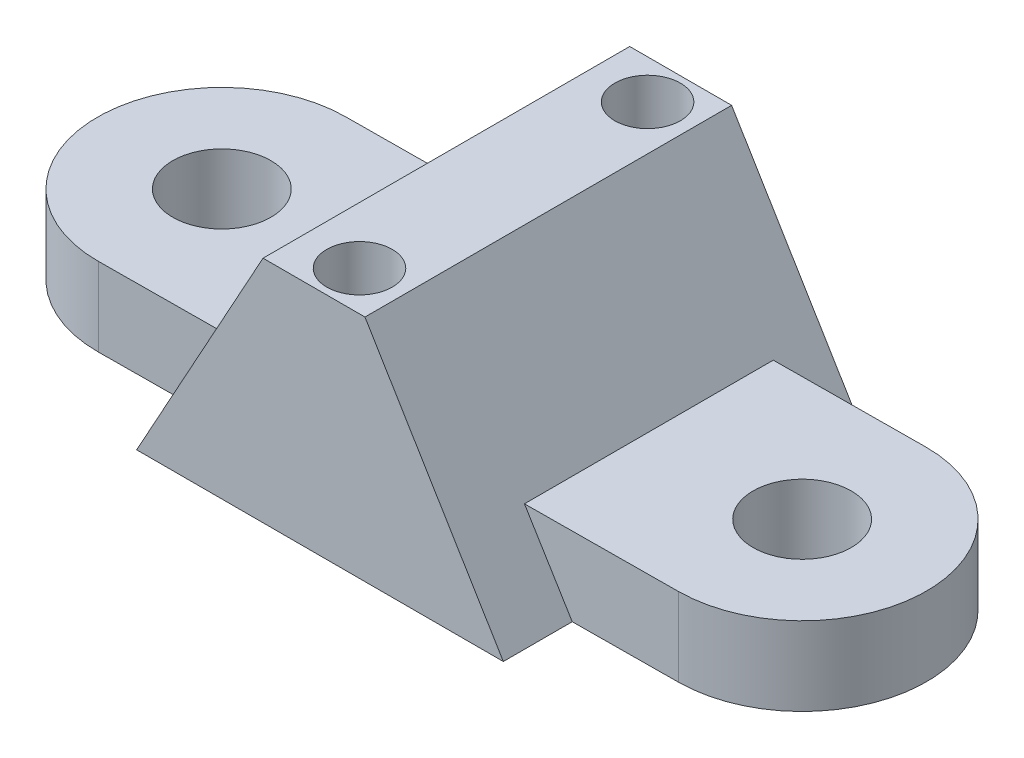
ISO-10303-21;
HEADER;
FILE_DESCRIPTION(('STEP AP214'),'2;1');
FILE_NAME('part.step','',(''),(''),'','','');
FILE_SCHEMA(('AUTOMOTIVE_DESIGN { 1 0 10303 214 1 1 1 1 }'));
ENDSEC;
DATA;
#1=APPLICATION_CONTEXT('core data for automotive mechanical design processes');
#2=APPLICATION_PROTOCOL_DEFINITION('international standard','automotive_design',2000,#1);
#3=PRODUCT_CONTEXT('',#1,'mechanical');
#4=PRODUCT('Part','Part','',(#3));
#5=PRODUCT_RELATED_PRODUCT_CATEGORY('part','',(#4));
#6=PRODUCT_DEFINITION_FORMATION('','',#4);
#7=PRODUCT_DEFINITION_CONTEXT('part definition',#1,'design');
#8=PRODUCT_DEFINITION('design','',#6,#7);
#9=PRODUCT_DEFINITION_SHAPE('','',#8);
#10=(LENGTH_UNIT() NAMED_UNIT(*) SI_UNIT(.MILLI.,.METRE.));
#11=(NAMED_UNIT(*) PLANE_ANGLE_UNIT() SI_UNIT($,.RADIAN.));
#12=(NAMED_UNIT(*) SI_UNIT($,.STERADIAN.) SOLID_ANGLE_UNIT());
#13=UNCERTAINTY_MEASURE_WITH_UNIT(LENGTH_MEASURE(1.E-05),#10,'distance_accuracy_value','');
#14=(GEOMETRIC_REPRESENTATION_CONTEXT(3) GLOBAL_UNCERTAINTY_ASSIGNED_CONTEXT((#13)) GLOBAL_UNIT_ASSIGNED_CONTEXT((#10,
#11,#12)) REPRESENTATION_CONTEXT('',''));
#15=CARTESIAN_POINT('',(0.,0.,0.));
#16=DIRECTION('',(0.,0.,1.));
#17=DIRECTION('',(1.,0.,0.));
#18=AXIS2_PLACEMENT_3D('',#15,#16,#17);
#19=CARTESIAN_POINT('',(-8.6988263836432,35.,56.));
#20=DIRECTION('',(0.875674720216931,-0.482901423038904,0.));
#21=DIRECTION('',(0.482901423038904,0.875674720216931,0.));
#22=AXIS2_PLACEMENT_3D('',#19,#20,#21);
#23=PLANE('',#22);
#24=DIRECTION('',(0.482898527062331,0.87566946876528,-0.0034632402982212));
#25=VECTOR('',#24,1.);
#26=CARTESIAN_POINT('',(-8.71598730364331,34.9688810529379,45.7388307557671));
#27=LINE('',#26,#25);
#28=CARTESIAN_POINT('',(-28.,0.,45.8771313844472));
#29=VERTEX_POINT('',#28);
#30=CARTESIAN_POINT('',(-21.3824547601062,12.,45.8296718291458));
#31=VERTEX_POINT('',#30);
#32=EDGE_CURVE('E207',#29,#31,#27,.T.);
#33=ORIENTED_EDGE('',*,*,#32,.F.);
#34=DIRECTION('',(0.,0.,-1.));
#35=VECTOR('',#34,1.);
#36=CARTESIAN_POINT('',(-28.,0.,56.));
#37=LINE('',#36,#35);
#38=CARTESIAN_POINT('',(-28.,0.,56.));
#39=VERTEX_POINT('',#38);
#40=EDGE_CURVE('E236',#39,#29,#37,.T.);
#41=ORIENTED_EDGE('',*,*,#40,.F.);
#42=DIRECTION('',(-0.482901423038904,-0.875674720216931,0.));
#43=VECTOR('',#42,1.);
#44=CARTESIAN_POINT('',(-8.6988263836432,35.,56.));
#45=LINE('',#44,#43);
#46=CARTESIAN_POINT('',(-8.6988263836432,35.,56.));
#47=VERTEX_POINT('',#46);
#48=EDGE_CURVE('E213',#47,#39,#45,.T.);
#49=ORIENTED_EDGE('',*,*,#48,.F.);
#50=DIRECTION('',(0.,0.,-1.));
#51=VECTOR('',#50,1.);
#52=CARTESIAN_POINT('',(-8.6988263836432,35.,56.));
#53=LINE('',#52,#51);
#54=CARTESIAN_POINT('',(-8.6988263836432,35.,0.));
#55=VERTEX_POINT('',#54);
#56=EDGE_CURVE('E239',#47,#55,#53,.T.);
#57=ORIENTED_EDGE('',*,*,#56,.T.);
#58=DIRECTION('',(-0.482901423038904,-0.875674720216931,0.));
#59=VECTOR('',#58,1.);
#60=CARTESIAN_POINT('',(-8.6988263836432,35.,0.));
#61=LINE('',#60,#59);
#62=CARTESIAN_POINT('',(-28.,0.,0.));
#63=VERTEX_POINT('',#62);
#64=EDGE_CURVE('E223',#55,#63,#61,.T.);
#65=ORIENTED_EDGE('',*,*,#64,.T.);
#66=CARTESIAN_POINT('',(-28.,0.,7.87615414383349));
#67=VERTEX_POINT('',#66);
#68=EDGE_CURVE('E235',#67,#63,#37,.T.);
#69=ORIENTED_EDGE('',*,*,#68,.F.);
#70=DIRECTION('',(0.482898527062331,0.87566946876528,-0.00346324029822119));
#71=VECTOR('',#70,1.);
#72=CARTESIAN_POINT('',(-8.77953989625151,34.8536372452037,7.73830930014221));
#73=LINE('',#72,#71);
#74=CARTESIAN_POINT('',(-21.3824547601062,12.,7.82869458853204));
#75=VERTEX_POINT('',#74);
#76=EDGE_CURVE('E205',#67,#75,#73,.T.);
#77=ORIENTED_EDGE('',*,*,#76,.T.);
#78=DIRECTION('',(0.,0.,-1.));
#79=VECTOR('',#78,1.);
#80=CARTESIAN_POINT('',(-21.3824547601062,12.,56.));
#81=LINE('',#80,#79);
#82=EDGE_CURVE('E171',#31,#75,#81,.T.);
#83=ORIENTED_EDGE('',*,*,#82,.F.);
#84=EDGE_LOOP('',(#33,#41,#49,#57,#65,#69,#77,#83));
#85=FACE_BOUND('',#84,.T.);
#86=ADVANCED_FACE('F67',(#85),#23,.F.);
#87=CARTESIAN_POINT('',(28.,0.,56.));
#88=DIRECTION('',(-0.856042259983815,-0.516905841640237,0.));
#89=DIRECTION('',(0.516905841640237,-0.856042259983815,0.));
#90=AXIS2_PLACEMENT_3D('',#87,#88,#89);
#91=PLANE('',#90);
#92=DIRECTION('',(0.516902289800679,-0.856036377820145,-0.00370710768403204));
#93=VECTOR('',#92,1.);
#94=CARTESIAN_POINT('',(27.9798328448716,0.033398610854824,45.4756565359413));
#95=LINE('',#94,#93);
#96=CARTESIAN_POINT('',(20.7540141536936,12.,45.5274784924736));
#97=VERTEX_POINT('',#96);
#98=CARTESIAN_POINT('',(28.,0.,45.4755119016125));
#99=VERTEX_POINT('',#98);
#100=EDGE_CURVE('E12',#97,#99,#95,.T.);
#101=ORIENTED_EDGE('',*,*,#100,.F.);
#102=DIRECTION('',(0.,0.,1.));
#103=VECTOR('',#102,1.);
#104=CARTESIAN_POINT('',(20.7540141536936,12.,56.));
#105=LINE('',#104,#103);
#106=CARTESIAN_POINT('',(20.7540141536936,12.,7.52650125185992));
#107=VERTEX_POINT('',#106);
#108=EDGE_CURVE('E242',#107,#97,#105,.T.);
#109=ORIENTED_EDGE('',*,*,#108,.F.);
#110=DIRECTION('',(0.516902289800679,-0.856036377820145,-0.00370710768403203));
#111=VECTOR('',#110,1.);
#112=CARTESIAN_POINT('',(27.9070148991553,0.153991635341852,7.47520152935799));
#113=LINE('',#112,#111);
#114=CARTESIAN_POINT('',(28.,0.,7.47453466099884));
#115=VERTEX_POINT('',#114);
#116=EDGE_CURVE('E75',#107,#115,#113,.T.);
#117=ORIENTED_EDGE('',*,*,#116,.T.);
#118=DIRECTION('',(0.,0.,-1.));
#119=VECTOR('',#118,1.);
#120=CARTESIAN_POINT('',(28.,0.,56.));
#121=LINE('',#120,#119);
#122=CARTESIAN_POINT('',(28.,0.,0.));
#123=VERTEX_POINT('',#122);
#124=EDGE_CURVE('E232',#115,#123,#121,.T.);
#125=ORIENTED_EDGE('',*,*,#124,.T.);
#126=DIRECTION('',(-0.516905841640237,0.856042259983816,0.));
#127=VECTOR('',#126,1.);
#128=CARTESIAN_POINT('',(28.,0.,0.));
#129=LINE('',#128,#127);
#130=CARTESIAN_POINT('',(6.86587461493976,35.,0.));
#131=VERTEX_POINT('',#130);
#132=EDGE_CURVE('E214',#123,#131,#129,.T.);
#133=ORIENTED_EDGE('',*,*,#132,.T.);
#134=DIRECTION('',(0.,0.,-1.));
#135=VECTOR('',#134,1.);
#136=CARTESIAN_POINT('',(6.86587461493976,35.,56.));
#137=LINE('',#136,#135);
#138=CARTESIAN_POINT('',(6.86587461493976,35.,56.));
#139=VERTEX_POINT('',#138);
#140=EDGE_CURVE('E220',#139,#131,#137,.T.);
#141=ORIENTED_EDGE('',*,*,#140,.F.);
#142=DIRECTION('',(-0.516905841640237,0.856042259983816,0.));
#143=VECTOR('',#142,1.);
#144=CARTESIAN_POINT('',(28.,0.,56.));
#145=LINE('',#144,#143);
#146=CARTESIAN_POINT('',(28.,0.,56.));
#147=VERTEX_POINT('',#146);
#148=EDGE_CURVE('E218',#147,#139,#145,.T.);
#149=ORIENTED_EDGE('',*,*,#148,.F.);
#150=EDGE_CURVE('E233',#147,#99,#121,.T.);
#151=ORIENTED_EDGE('',*,*,#150,.T.);
#152=EDGE_LOOP('',(#101,#109,#117,#125,#133,#141,#149,#151));
#153=FACE_BOUND('',#152,.T.);
#154=ADVANCED_FACE('F246',(#153),#91,.F.);
#155=CARTESIAN_POINT('',(6.86587461493976,35.,56.));
#156=DIRECTION('',(0.,-1.,0.));
#157=DIRECTION('',(0.,0.,-1.));
#158=AXIS2_PLACEMENT_3D('',#155,#156,#157);
#159=PLANE('',#158);
#160=CARTESIAN_POINT('',(0.,35.,5.96773164137245));
#161=DIRECTION('',(0.,1.,0.));
#162=DIRECTION('',(0.,0.,1.));
#163=AXIS2_PLACEMENT_3D('',#160,#161,#162);
#164=CIRCLE('',#163,5.);
#165=CARTESIAN_POINT('',(0.,35.,10.9677316413725));
#166=VERTEX_POINT('',#165);
#167=EDGE_CURVE('E344',#166,#166,#164,.T.);
#168=ORIENTED_EDGE('',*,*,#167,.F.);
#169=EDGE_LOOP('',(#168));
#170=FACE_BOUND('',#169,.T.);
#171=CARTESIAN_POINT('',(0.,35.,49.9677316413725));
#172=DIRECTION('',(0.,1.,0.));
#173=DIRECTION('',(0.,0.,1.));
#174=AXIS2_PLACEMENT_3D('',#171,#172,#173);
#175=CIRCLE('',#174,5.);
#176=CARTESIAN_POINT('',(0.,35.,54.9677316413724));
#177=VERTEX_POINT('',#176);
#178=EDGE_CURVE('E351',#177,#177,#175,.T.);
#179=ORIENTED_EDGE('',*,*,#178,.F.);
#180=EDGE_LOOP('',(#179));
#181=FACE_BOUND('',#180,.T.);
#182=DIRECTION('',(-1.,0.,0.));
#183=VECTOR('',#182,1.);
#184=CARTESIAN_POINT('',(6.86587461493976,35.,0.));
#185=LINE('',#184,#183);
#186=EDGE_CURVE('E209',#131,#55,#185,.T.);
#187=ORIENTED_EDGE('',*,*,#186,.T.);
#188=ORIENTED_EDGE('',*,*,#56,.F.);
#189=DIRECTION('',(-1.,0.,0.));
#190=VECTOR('',#189,1.);
#191=CARTESIAN_POINT('',(6.86587461493976,35.,56.));
#192=LINE('',#191,#190);
#193=EDGE_CURVE('E210',#139,#47,#192,.T.);
#194=ORIENTED_EDGE('',*,*,#193,.F.);
#195=ORIENTED_EDGE('',*,*,#140,.T.);
#196=EDGE_LOOP('',(#187,#188,#194,#195));
#197=FACE_BOUND('',#196,.T.);
#198=ADVANCED_FACE('F69',(#170,#181,#197),#159,.F.);
#199=CARTESIAN_POINT('',(-28.,0.,56.));
#200=DIRECTION('',(0.,1.,0.));
#201=DIRECTION('',(0.,0.,1.));
#202=AXIS2_PLACEMENT_3D('',#199,#200,#201);
#203=PLANE('',#202);
#204=CARTESIAN_POINT('',(0.,0.,5.96773164137245));
#205=DIRECTION('',(0.,1.,0.));
#206=DIRECTION('',(0.,0.,1.));
#207=AXIS2_PLACEMENT_3D('',#204,#205,#206);
#208=CIRCLE('',#207,5.);
#209=CARTESIAN_POINT('',(0.,0.,10.9677316413725));
#210=VERTEX_POINT('',#209);
#211=EDGE_CURVE('E341',#210,#210,#208,.T.);
#212=ORIENTED_EDGE('',*,*,#211,.T.);
#213=EDGE_LOOP('',(#212));
#214=FACE_BOUND('',#213,.T.);
#215=CARTESIAN_POINT('',(0.,0.,49.9677316413725));
#216=DIRECTION('',(0.,1.,0.));
#217=DIRECTION('',(0.,0.,1.));
#218=AXIS2_PLACEMENT_3D('',#215,#216,#217);
#219=CIRCLE('',#218,5.);
#220=CARTESIAN_POINT('',(0.,0.,54.9677316413724));
#221=VERTEX_POINT('',#220);
#222=EDGE_CURVE('E346',#221,#221,#219,.T.);
#223=ORIENTED_EDGE('',*,*,#222,.T.);
#224=EDGE_LOOP('',(#223));
#225=FACE_BOUND('',#224,.T.);
#226=ORIENTED_EDGE('',*,*,#124,.F.);
#227=DIRECTION('',(0.999974283803085,0.,-0.00717159204837396));
#228=VECTOR('',#227,1.);
#229=CARTESIAN_POINT('',(-44.1362602489191,0.,7.99187979554877));
#230=LINE('',#229,#228);
#231=CARTESIAN_POINT('',(43.8637397510809,0.,7.36076346538005));
#232=VERTEX_POINT('',#231);
#233=EDGE_CURVE('E192',#115,#232,#230,.T.);
#234=ORIENTED_EDGE('',*,*,#233,.T.);
#235=CARTESIAN_POINT('',(44.,0.,26.3602748576387));
#236=DIRECTION('',(0.,-1.,0.));
#237=DIRECTION('',(0.,0.,-1.));
#238=AXIS2_PLACEMENT_3D('',#235,#236,#237);
#239=CIRCLE('',#238,19.);
#240=CARTESIAN_POINT('',(44.1362602489191,0.,45.3597862498973));
#241=VERTEX_POINT('',#240);
#242=EDGE_CURVE('E195',#232,#241,#239,.T.);
#243=ORIENTED_EDGE('',*,*,#242,.T.);
#244=DIRECTION('',(0.999974283803085,0.,-0.00717159204837398));
#245=VECTOR('',#244,1.);
#246=CARTESIAN_POINT('',(-43.8637397510809,0.,45.990902580066));
#247=LINE('',#246,#245);
#248=EDGE_CURVE('E180',#99,#241,#247,.T.);
#249=ORIENTED_EDGE('',*,*,#248,.F.);
#250=ORIENTED_EDGE('',*,*,#150,.F.);
#251=DIRECTION('',(1.,0.,0.));
#252=VECTOR('',#251,1.);
#253=CARTESIAN_POINT('',(-28.,0.,56.));
#254=LINE('',#253,#252);
#255=EDGE_CURVE('E216',#39,#147,#254,.T.);
#256=ORIENTED_EDGE('',*,*,#255,.F.);
#257=ORIENTED_EDGE('',*,*,#40,.T.);
#258=CARTESIAN_POINT('',(-43.8637397510809,0.,45.990902580066));
#259=VERTEX_POINT('',#258);
#260=EDGE_CURVE('E178',#259,#29,#247,.T.);
#261=ORIENTED_EDGE('',*,*,#260,.F.);
#262=CARTESIAN_POINT('',(-44.,0.,26.9913911878074));
#263=DIRECTION('',(0.,-1.,0.));
#264=DIRECTION('',(0.,0.,-1.));
#265=AXIS2_PLACEMENT_3D('',#262,#263,#264);
#266=CIRCLE('',#265,19.);
#267=CARTESIAN_POINT('',(-44.1362602489191,0.,7.99187979554877));
#268=VERTEX_POINT('',#267);
#269=EDGE_CURVE('E190',#259,#268,#266,.T.);
#270=ORIENTED_EDGE('',*,*,#269,.T.);
#271=EDGE_CURVE('E82',#268,#67,#230,.T.);
#272=ORIENTED_EDGE('',*,*,#271,.T.);
#273=ORIENTED_EDGE('',*,*,#68,.T.);
#274=DIRECTION('',(1.,0.,0.));
#275=VECTOR('',#274,1.);
#276=CARTESIAN_POINT('',(-28.,0.,0.));
#277=LINE('',#276,#275);
#278=EDGE_CURVE('E226',#63,#123,#277,.T.);
#279=ORIENTED_EDGE('',*,*,#278,.T.);
#280=EDGE_LOOP('',(#226,#234,#243,#249,#250,#256,#257,#261,#270,#272,#273,#279));
#281=FACE_BOUND('',#280,.T.);
#282=CARTESIAN_POINT('',(44.,0.,26.3602748576387));
#283=DIRECTION('',(0.,-1.,0.));
#284=DIRECTION('',(0.,0.,-1.));
#285=AXIS2_PLACEMENT_3D('',#282,#283,#284);
#286=CIRCLE('',#285,7.50000000000001);
#287=CARTESIAN_POINT('',(44.,0.,18.8602748576386));
#288=VERTEX_POINT('',#287);
#289=EDGE_CURVE('E348',#288,#288,#286,.T.);
#290=ORIENTED_EDGE('',*,*,#289,.F.);
#291=EDGE_LOOP('',(#290));
#292=FACE_BOUND('',#291,.T.);
#293=CARTESIAN_POINT('',(-44.,0.,26.9913911878074));
#294=DIRECTION('',(0.,-1.,0.));
#295=DIRECTION('',(0.,0.,-1.));
#296=AXIS2_PLACEMENT_3D('',#293,#294,#295);
#297=CIRCLE('',#296,7.5);
#298=CARTESIAN_POINT('',(-44.,0.,19.4913911878074));
#299=VERTEX_POINT('',#298);
#300=EDGE_CURVE('E183',#299,#299,#297,.T.);
#301=ORIENTED_EDGE('',*,*,#300,.F.);
#302=EDGE_LOOP('',(#301));
#303=FACE_BOUND('',#302,.T.);
#304=ADVANCED_FACE('F252',(#214,#225,#281,#292,#303),#203,.F.);
#305=CARTESIAN_POINT('',(0.,0.,56.));
#306=DIRECTION('',(0.,0.,1.));
#307=DIRECTION('',(1.,0.,0.));
#308=AXIS2_PLACEMENT_3D('',#305,#306,#307);
#309=PLANE('',#308);
#310=ORIENTED_EDGE('',*,*,#193,.T.);
#311=ORIENTED_EDGE('',*,*,#48,.T.);
#312=ORIENTED_EDGE('',*,*,#255,.T.);
#313=ORIENTED_EDGE('',*,*,#148,.T.);
#314=EDGE_LOOP('',(#310,#311,#312,#313));
#315=FACE_BOUND('',#314,.T.);
#316=ADVANCED_FACE('F267',(#315),#309,.T.);
#317=CARTESIAN_POINT('',(0.,0.,0.));
#318=DIRECTION('',(0.,0.,1.));
#319=DIRECTION('',(1.,0.,0.));
#320=AXIS2_PLACEMENT_3D('',#317,#318,#319);
#321=PLANE('',#320);
#322=ORIENTED_EDGE('',*,*,#186,.F.);
#323=ORIENTED_EDGE('',*,*,#132,.F.);
#324=ORIENTED_EDGE('',*,*,#278,.F.);
#325=ORIENTED_EDGE('',*,*,#64,.F.);
#326=EDGE_LOOP('',(#322,#323,#324,#325));
#327=FACE_BOUND('',#326,.T.);
#328=ADVANCED_FACE('F260',(#327),#321,.F.);
#329=CARTESIAN_POINT('',(44.,12.,26.3602748576387));
#330=DIRECTION('',(0.,-1.,0.));
#331=DIRECTION('',(0.,0.,-1.));
#332=AXIS2_PLACEMENT_3D('',#329,#330,#331);
#333=CYLINDRICAL_SURFACE('',#332,19.);
#334=ORIENTED_EDGE('',*,*,#242,.F.);
#335=DIRECTION('',(0.,-1.,0.));
#336=VECTOR('',#335,1.);
#337=CARTESIAN_POINT('',(43.8637397510809,12.,7.36076346538005));
#338=LINE('',#337,#336);
#339=CARTESIAN_POINT('',(43.8637397510809,12.,7.36076346538005));
#340=VERTEX_POINT('',#339);
#341=EDGE_CURVE('E162',#340,#232,#338,.T.);
#342=ORIENTED_EDGE('',*,*,#341,.F.);
#343=CARTESIAN_POINT('',(44.,12.,26.3602748576387));
#344=DIRECTION('',(0.,-1.,0.));
#345=DIRECTION('',(0.,0.,-1.));
#346=AXIS2_PLACEMENT_3D('',#343,#344,#345);
#347=CIRCLE('',#346,19.);
#348=CARTESIAN_POINT('',(44.1362602489191,12.,45.3597862498973));
#349=VERTEX_POINT('',#348);
#350=EDGE_CURVE('E172',#340,#349,#347,.T.);
#351=ORIENTED_EDGE('',*,*,#350,.T.);
#352=DIRECTION('',(0.,-1.,0.));
#353=VECTOR('',#352,1.);
#354=CARTESIAN_POINT('',(44.1362602489191,12.,45.3597862498973));
#355=LINE('',#354,#353);
#356=EDGE_CURVE('E199',#349,#241,#355,.T.);
#357=ORIENTED_EDGE('',*,*,#356,.T.);
#358=EDGE_LOOP('',(#334,#342,#351,#357));
#359=FACE_BOUND('',#358,.T.);
#360=ADVANCED_FACE('F279',(#359),#333,.T.);
#361=CARTESIAN_POINT('',(44.,12.,26.3602748576387));
#362=DIRECTION('',(0.,-1.,0.));
#363=DIRECTION('',(0.,0.,-1.));
#364=AXIS2_PLACEMENT_3D('',#361,#362,#363);
#365=CYLINDRICAL_SURFACE('',#364,7.50000000000001);
#366=CARTESIAN_POINT('',(44.,12.,26.3602748576387));
#367=DIRECTION('',(0.,-1.,0.));
#368=DIRECTION('',(0.,0.,-1.));
#369=AXIS2_PLACEMENT_3D('',#366,#367,#368);
#370=CIRCLE('',#369,7.50000000000001);
#371=CARTESIAN_POINT('',(44.,12.,18.8602748576386));
#372=VERTEX_POINT('',#371);
#373=EDGE_CURVE('E356',#372,#372,#370,.T.);
#374=ORIENTED_EDGE('',*,*,#373,.F.);
#375=EDGE_LOOP('',(#374));
#376=FACE_BOUND('',#375,.T.);
#377=ORIENTED_EDGE('',*,*,#289,.T.);
#378=EDGE_LOOP('',(#377));
#379=FACE_BOUND('',#378,.T.);
#380=ADVANCED_FACE('F281',(#376,#379),#365,.F.);
#381=CARTESIAN_POINT('',(-44.,12.,26.9913911878074));
#382=DIRECTION('',(0.,-1.,0.));
#383=DIRECTION('',(0.,0.,-1.));
#384=AXIS2_PLACEMENT_3D('',#381,#382,#383);
#385=PLANE('',#384);
#386=ORIENTED_EDGE('',*,*,#373,.T.);
#387=EDGE_LOOP('',(#386));
#388=FACE_BOUND('',#387,.T.);
#389=DIRECTION('',(0.999974283803085,0.,-0.00717159204837396));
#390=VECTOR('',#389,1.);
#391=CARTESIAN_POINT('',(-44.1362602489191,12.,7.99187979554877));
#392=LINE('',#391,#390);
#393=EDGE_CURVE('E173',#107,#340,#392,.T.);
#394=ORIENTED_EDGE('',*,*,#393,.F.);
#395=ORIENTED_EDGE('',*,*,#108,.T.);
#396=DIRECTION('',(0.999974283803085,0.,-0.00717159204837398));
#397=VECTOR('',#396,1.);
#398=CARTESIAN_POINT('',(-43.8637397510809,12.,45.990902580066));
#399=LINE('',#398,#397);
#400=EDGE_CURVE('E188',#97,#349,#399,.T.);
#401=ORIENTED_EDGE('',*,*,#400,.T.);
#402=ORIENTED_EDGE('',*,*,#350,.F.);
#403=EDGE_LOOP('',(#394,#395,#401,#402));
#404=FACE_BOUND('',#403,.T.);
#405=ADVANCED_FACE('F277',(#388,#404),#385,.F.);
#406=CARTESIAN_POINT('',(-44.1362602489191,12.,7.99187979554877));
#407=DIRECTION('',(-0.00717159204837396,0.,-0.999974283803084));
#408=DIRECTION('',(-0.999974283803085,0.,0.00717159204837396));
#409=AXIS2_PLACEMENT_3D('',#406,#407,#408);
#410=PLANE('',#409);
#411=ORIENTED_EDGE('',*,*,#116,.F.);
#412=ORIENTED_EDGE('',*,*,#393,.T.);
#413=ORIENTED_EDGE('',*,*,#341,.T.);
#414=ORIENTED_EDGE('',*,*,#233,.F.);
#415=EDGE_LOOP('',(#411,#412,#413,#414));
#416=FACE_BOUND('',#415,.T.);
#417=ADVANCED_FACE('F249',(#416),#410,.T.);
#418=CARTESIAN_POINT('',(-43.8637397510809,12.,45.990902580066));
#419=DIRECTION('',(-0.00717159204837398,0.,-0.999974283803084));
#420=DIRECTION('',(-0.999974283803085,0.,0.00717159204837398));
#421=AXIS2_PLACEMENT_3D('',#418,#419,#420);
#422=PLANE('',#421);
#423=ORIENTED_EDGE('',*,*,#400,.F.);
#424=ORIENTED_EDGE('',*,*,#100,.T.);
#425=ORIENTED_EDGE('',*,*,#248,.T.);
#426=ORIENTED_EDGE('',*,*,#356,.F.);
#427=EDGE_LOOP('',(#423,#424,#425,#426));
#428=FACE_BOUND('',#427,.T.);
#429=ADVANCED_FACE('F273',(#428),#422,.F.);
#430=ORIENTED_EDGE('',*,*,#260,.T.);
#431=ORIENTED_EDGE('',*,*,#32,.T.);
#432=CARTESIAN_POINT('',(-43.8637397510809,12.,45.990902580066));
#433=VERTEX_POINT('',#432);
#434=EDGE_CURVE('E163',#433,#31,#399,.T.);
#435=ORIENTED_EDGE('',*,*,#434,.F.);
#436=DIRECTION('',(0.,-1.,0.));
#437=VECTOR('',#436,1.);
#438=CARTESIAN_POINT('',(-43.8637397510809,12.,45.990902580066));
#439=LINE('',#438,#437);
#440=EDGE_CURVE('E176',#433,#259,#439,.T.);
#441=ORIENTED_EDGE('',*,*,#440,.T.);
#442=EDGE_LOOP('',(#430,#431,#435,#441));
#443=FACE_BOUND('',#442,.T.);
#444=ADVANCED_FACE('F308',(#443),#422,.F.);
#445=ORIENTED_EDGE('',*,*,#76,.F.);
#446=ORIENTED_EDGE('',*,*,#271,.F.);
#447=DIRECTION('',(0.,-1.,0.));
#448=VECTOR('',#447,1.);
#449=CARTESIAN_POINT('',(-44.1362602489191,12.,7.99187979554877));
#450=LINE('',#449,#448);
#451=CARTESIAN_POINT('',(-44.1362602489191,12.,7.99187979554877));
#452=VERTEX_POINT('',#451);
#453=EDGE_CURVE('E154',#452,#268,#450,.T.);
#454=ORIENTED_EDGE('',*,*,#453,.F.);
#455=EDGE_CURVE('E157',#452,#75,#392,.T.);
#456=ORIENTED_EDGE('',*,*,#455,.T.);
#457=EDGE_LOOP('',(#445,#446,#454,#456));
#458=FACE_BOUND('',#457,.T.);
#459=ADVANCED_FACE('F156',(#458),#410,.T.);
#460=CARTESIAN_POINT('',(-44.,12.,26.9913911878074));
#461=DIRECTION('',(0.,-1.,0.));
#462=DIRECTION('',(0.,0.,-1.));
#463=AXIS2_PLACEMENT_3D('',#460,#461,#462);
#464=CIRCLE('',#463,7.5);
#465=CARTESIAN_POINT('',(-44.,12.,19.4913911878074));
#466=VERTEX_POINT('',#465);
#467=EDGE_CURVE('E193',#466,#466,#464,.T.);
#468=ORIENTED_EDGE('',*,*,#467,.T.);
#469=EDGE_LOOP('',(#468));
#470=FACE_BOUND('',#469,.T.);
#471=ORIENTED_EDGE('',*,*,#434,.T.);
#472=ORIENTED_EDGE('',*,*,#82,.T.);
#473=ORIENTED_EDGE('',*,*,#455,.F.);
#474=CARTESIAN_POINT('',(-44.,12.,26.9913911878074));
#475=DIRECTION('',(0.,-1.,0.));
#476=DIRECTION('',(0.,0.,-1.));
#477=AXIS2_PLACEMENT_3D('',#474,#475,#476);
#478=CIRCLE('',#477,19.);
#479=EDGE_CURVE('E169',#433,#452,#478,.T.);
#480=ORIENTED_EDGE('',*,*,#479,.F.);
#481=EDGE_LOOP('',(#471,#472,#473,#480));
#482=FACE_BOUND('',#481,.T.);
#483=ADVANCED_FACE('F168',(#470,#482),#385,.F.);
#484=CARTESIAN_POINT('',(-44.,12.,26.9913911878074));
#485=DIRECTION('',(0.,-1.,0.));
#486=DIRECTION('',(0.,0.,-1.));
#487=AXIS2_PLACEMENT_3D('',#484,#485,#486);
#488=CYLINDRICAL_SURFACE('',#487,19.);
#489=ORIENTED_EDGE('',*,*,#269,.F.);
#490=ORIENTED_EDGE('',*,*,#440,.F.);
#491=ORIENTED_EDGE('',*,*,#479,.T.);
#492=ORIENTED_EDGE('',*,*,#453,.T.);
#493=EDGE_LOOP('',(#489,#490,#491,#492));
#494=FACE_BOUND('',#493,.T.);
#495=ADVANCED_FACE('F175',(#494),#488,.T.);
#496=CARTESIAN_POINT('',(-44.,12.,26.9913911878074));
#497=DIRECTION('',(0.,-1.,0.));
#498=DIRECTION('',(0.,0.,-1.));
#499=AXIS2_PLACEMENT_3D('',#496,#497,#498);
#500=CYLINDRICAL_SURFACE('',#499,7.5);
#501=ORIENTED_EDGE('',*,*,#467,.F.);
#502=EDGE_LOOP('',(#501));
#503=FACE_BOUND('',#502,.T.);
#504=ORIENTED_EDGE('',*,*,#300,.T.);
#505=EDGE_LOOP('',(#504));
#506=FACE_BOUND('',#505,.T.);
#507=ADVANCED_FACE('F306',(#503,#506),#500,.F.);
#508=CARTESIAN_POINT('',(0.,0.,49.9677316413725));
#509=DIRECTION('',(0.,1.,0.));
#510=DIRECTION('',(0.,0.,1.));
#511=AXIS2_PLACEMENT_3D('',#508,#509,#510);
#512=CYLINDRICAL_SURFACE('',#511,5.);
#513=ORIENTED_EDGE('',*,*,#222,.F.);
#514=EDGE_LOOP('',(#513));
#515=FACE_BOUND('',#514,.T.);
#516=ORIENTED_EDGE('',*,*,#178,.T.);
#517=EDGE_LOOP('',(#516));
#518=FACE_BOUND('',#517,.T.);
#519=ADVANCED_FACE('F327',(#515,#518),#512,.F.);
#520=CARTESIAN_POINT('',(0.,0.,5.96773164137245));
#521=DIRECTION('',(0.,1.,0.));
#522=DIRECTION('',(0.,0.,1.));
#523=AXIS2_PLACEMENT_3D('',#520,#521,#522);
#524=CYLINDRICAL_SURFACE('',#523,5.);
#525=ORIENTED_EDGE('',*,*,#211,.F.);
#526=EDGE_LOOP('',(#525));
#527=FACE_BOUND('',#526,.T.);
#528=ORIENTED_EDGE('',*,*,#167,.T.);
#529=EDGE_LOOP('',(#528));
#530=FACE_BOUND('',#529,.T.);
#531=ADVANCED_FACE('F332',(#527,#530),#524,.F.);
#532=CLOSED_SHELL('',(#86,#154,#198,#304,#316,#328,#360,#380,#405,#417,#429,#444,#459,#483,#495,
#507,#519,#531));
#533=MANIFOLD_SOLID_BREP('B2',#532);
#534=ADVANCED_BREP_SHAPE_REPRESENTATION('',(#18,#533),#14);
#535=SHAPE_DEFINITION_REPRESENTATION(#9,#534);
ENDSEC;
END-ISO-10303-21;
